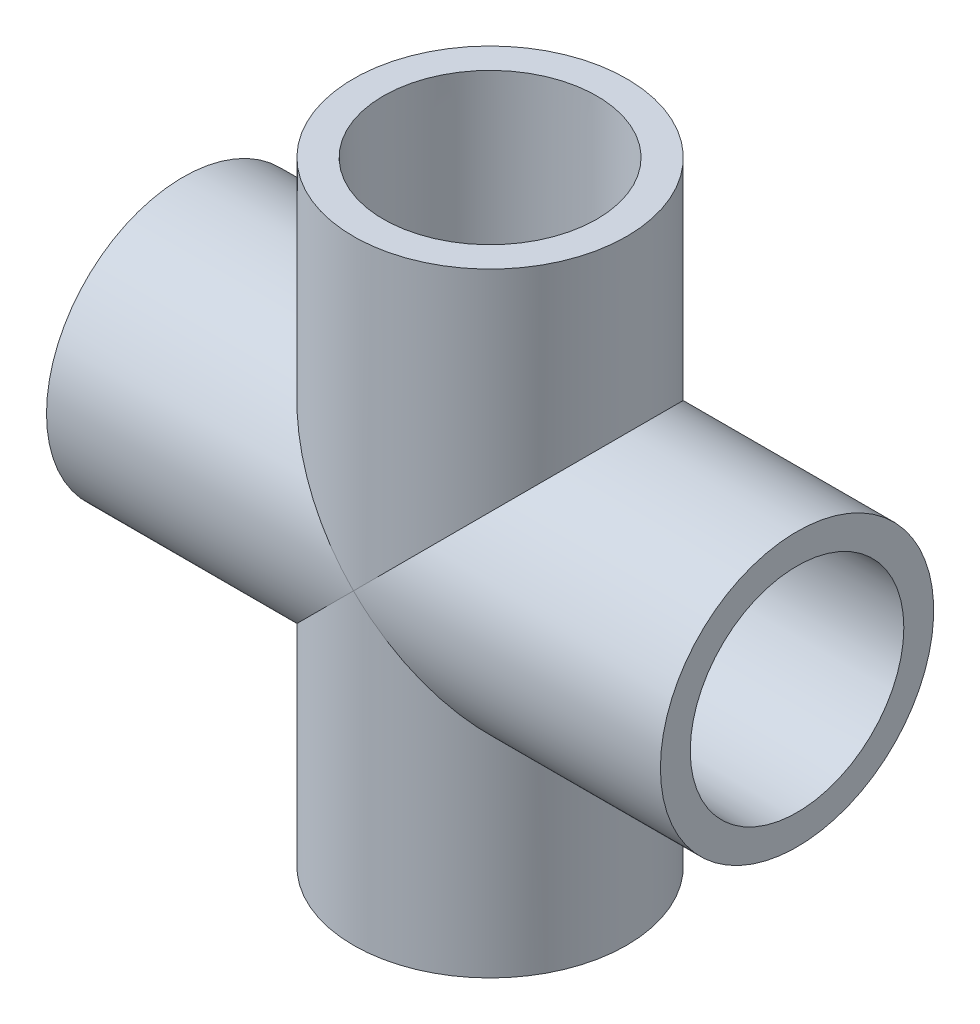
ISO-10303-21;
HEADER;
FILE_DESCRIPTION(('STEP AP214'),'2;1');
FILE_NAME('part.step','',(''),(''),'','','');
FILE_SCHEMA(('AUTOMOTIVE_DESIGN { 1 0 10303 214 1 1 1 1 }'));
ENDSEC;
DATA;
#1=APPLICATION_CONTEXT('core data for automotive mechanical design processes');
#2=APPLICATION_PROTOCOL_DEFINITION('international standard','automotive_design',2000,#1);
#3=PRODUCT_CONTEXT('',#1,'mechanical');
#4=PRODUCT('Part','Part','',(#3));
#5=PRODUCT_RELATED_PRODUCT_CATEGORY('part','',(#4));
#6=PRODUCT_DEFINITION_FORMATION('','',#4);
#7=PRODUCT_DEFINITION_CONTEXT('part definition',#1,'design');
#8=PRODUCT_DEFINITION('design','',#6,#7);
#9=PRODUCT_DEFINITION_SHAPE('','',#8);
#10=(LENGTH_UNIT() NAMED_UNIT(*) SI_UNIT(.MILLI.,.METRE.));
#11=(NAMED_UNIT(*) PLANE_ANGLE_UNIT() SI_UNIT($,.RADIAN.));
#12=(NAMED_UNIT(*) SI_UNIT($,.STERADIAN.) SOLID_ANGLE_UNIT());
#13=UNCERTAINTY_MEASURE_WITH_UNIT(LENGTH_MEASURE(1.E-05),#10,'distance_accuracy_value','');
#14=(GEOMETRIC_REPRESENTATION_CONTEXT(3) GLOBAL_UNCERTAINTY_ASSIGNED_CONTEXT((#13)) GLOBAL_UNIT_ASSIGNED_CONTEXT((#10,
#11,#12)) REPRESENTATION_CONTEXT('',''));
#15=CARTESIAN_POINT('',(0.,0.,0.));
#16=DIRECTION('',(0.,0.,1.));
#17=DIRECTION('',(1.,0.,0.));
#18=AXIS2_PLACEMENT_3D('',#15,#16,#17);
#19=CARTESIAN_POINT('',(0.,13.49375,0.));
#20=DIRECTION('',(0.,-1.,0.));
#21=DIRECTION('',(1.,0.,0.));
#22=AXIS2_PLACEMENT_3D('',#19,#20,#21);
#23=PLANE('',#22);
#24=CARTESIAN_POINT('',(0.,13.49375,0.));
#25=DIRECTION('',(0.,-1.,0.));
#26=DIRECTION('',(1.,0.,0.));
#27=AXIS2_PLACEMENT_3D('',#24,#25,#26);
#28=CIRCLE('',#27,10.6172);
#29=CARTESIAN_POINT('',(10.6172,13.49375,0.));
#30=VERTEX_POINT('',#29);
#31=EDGE_CURVE('E82',#30,#30,#28,.T.);
#32=ORIENTED_EDGE('',*,*,#31,.F.);
#33=EDGE_LOOP('',(#32));
#34=FACE_BOUND('',#33,.T.);
#35=CARTESIAN_POINT('',(0.,13.49375,0.));
#36=DIRECTION('',(0.,1.,0.));
#37=DIRECTION('',(-1.,0.,0.));
#38=AXIS2_PLACEMENT_3D('',#35,#36,#37);
#39=CIRCLE('',#38,7.89940000000001);
#40=CARTESIAN_POINT('',(-7.89940000000001,13.49375,0.));
#41=VERTEX_POINT('',#40);
#42=EDGE_CURVE('E126',#41,#41,#39,.T.);
#43=ORIENTED_EDGE('',*,*,#42,.F.);
#44=EDGE_LOOP('',(#43));
#45=FACE_BOUND('',#44,.T.);
#46=ADVANCED_FACE('F34',(#34,#45),#23,.F.);
#47=CARTESIAN_POINT('',(0.,-13.49375,0.));
#48=DIRECTION('',(0.,-1.,0.));
#49=DIRECTION('',(1.,0.,0.));
#50=AXIS2_PLACEMENT_3D('',#47,#48,#49);
#51=PLANE('',#50);
#52=CARTESIAN_POINT('',(0.,-13.49375,0.));
#53=DIRECTION('',(0.,1.,0.));
#54=DIRECTION('',(-1.,0.,0.));
#55=AXIS2_PLACEMENT_3D('',#52,#53,#54);
#56=CIRCLE('',#55,7.89940000000001);
#57=CARTESIAN_POINT('',(-7.89940000000001,-13.49375,0.));
#58=VERTEX_POINT('',#57);
#59=EDGE_CURVE('E129',#58,#58,#56,.T.);
#60=ORIENTED_EDGE('',*,*,#59,.T.);
#61=EDGE_LOOP('',(#60));
#62=FACE_BOUND('',#61,.T.);
#63=CARTESIAN_POINT('',(0.,-13.49375,0.));
#64=DIRECTION('',(0.,-1.,0.));
#65=DIRECTION('',(1.,0.,0.));
#66=AXIS2_PLACEMENT_3D('',#63,#64,#65);
#67=CIRCLE('',#66,10.6172);
#68=CARTESIAN_POINT('',(10.6172,-13.49375,0.));
#69=VERTEX_POINT('',#68);
#70=EDGE_CURVE('E117',#69,#69,#67,.T.);
#71=ORIENTED_EDGE('',*,*,#70,.T.);
#72=EDGE_LOOP('',(#71));
#73=FACE_BOUND('',#72,.T.);
#74=ADVANCED_FACE('F133',(#62,#73),#51,.T.);
#75=CARTESIAN_POINT('',(30.95625,0.,0.));
#76=DIRECTION('',(1.,0.,0.));
#77=DIRECTION('',(0.,0.,-1.));
#78=AXIS2_PLACEMENT_3D('',#75,#76,#77);
#79=CYLINDRICAL_SURFACE('',#78,7.8994);
#80=CARTESIAN_POINT('',(13.49375,0.,0.));
#81=DIRECTION('',(1.,0.,0.));
#82=DIRECTION('',(0.,0.,-1.));
#83=AXIS2_PLACEMENT_3D('',#80,#81,#82);
#84=CIRCLE('',#83,7.8994);
#85=CARTESIAN_POINT('',(13.49375,0.,-7.8994));
#86=VERTEX_POINT('',#85);
#87=EDGE_CURVE('E123',#86,#86,#84,.T.);
#88=ORIENTED_EDGE('',*,*,#87,.T.);
#89=EDGE_LOOP('',(#88));
#90=FACE_BOUND('',#89,.T.);
#91=CARTESIAN_POINT('',(0.,0.,0.));
#92=DIRECTION('',(0.707106781186548,-0.707106781186547,0.));
#93=DIRECTION('',(0.707106781186547,0.707106781186548,0.));
#94=AXIS2_PLACEMENT_3D('',#91,#92,#93);
#95=ELLIPSE('',#94,11.17143861461,7.8994);
#96=CARTESIAN_POINT('',(0.,0.,7.8994));
#97=VERTEX_POINT('',#96);
#98=CARTESIAN_POINT('',(0.,0.,-7.8994));
#99=VERTEX_POINT('',#98);
#100=EDGE_CURVE('E47',#97,#99,#95,.F.);
#101=ORIENTED_EDGE('',*,*,#100,.T.);
#102=CARTESIAN_POINT('',(0.,0.,0.));
#103=DIRECTION('',(0.707106781186547,0.707106781186548,0.));
#104=DIRECTION('',(0.707106781186548,-0.707106781186547,0.));
#105=AXIS2_PLACEMENT_3D('',#102,#103,#104);
#106=ELLIPSE('',#105,11.17143861461,7.8994);
#107=EDGE_CURVE('E11',#99,#97,#106,.F.);
#108=ORIENTED_EDGE('',*,*,#107,.T.);
#109=EDGE_LOOP('',(#101,#108));
#110=FACE_BOUND('',#109,.T.);
#111=ADVANCED_FACE('F74',(#90,#110),#79,.F.);
#112=CARTESIAN_POINT('',(-13.49375,0.,0.));
#113=DIRECTION('',(1.,0.,0.));
#114=DIRECTION('',(0.,0.,-1.));
#115=AXIS2_PLACEMENT_3D('',#112,#113,#114);
#116=CIRCLE('',#115,7.8994);
#117=CARTESIAN_POINT('',(-13.49375,0.,-7.8994));
#118=VERTEX_POINT('',#117);
#119=EDGE_CURVE('E120',#118,#118,#116,.T.);
#120=ORIENTED_EDGE('',*,*,#119,.F.);
#121=EDGE_LOOP('',(#120));
#122=FACE_BOUND('',#121,.T.);
#123=CARTESIAN_POINT('',(0.,0.,0.));
#124=DIRECTION('',(0.707106781186548,-0.707106781186547,0.));
#125=DIRECTION('',(0.707106781186547,0.707106781186548,0.));
#126=AXIS2_PLACEMENT_3D('',#123,#124,#125);
#127=ELLIPSE('',#126,11.17143861461,7.8994);
#128=EDGE_CURVE('E64',#97,#99,#127,.T.);
#129=ORIENTED_EDGE('',*,*,#128,.T.);
#130=CARTESIAN_POINT('',(0.,0.,0.));
#131=DIRECTION('',(0.707106781186547,0.707106781186548,0.));
#132=DIRECTION('',(0.707106781186548,-0.707106781186547,0.));
#133=AXIS2_PLACEMENT_3D('',#130,#131,#132);
#134=ELLIPSE('',#133,11.17143861461,7.8994);
#135=EDGE_CURVE('E42',#99,#97,#134,.T.);
#136=ORIENTED_EDGE('',*,*,#135,.T.);
#137=EDGE_LOOP('',(#129,#136));
#138=FACE_BOUND('',#137,.T.);
#139=ADVANCED_FACE('F75',(#122,#138),#79,.F.);
#140=CARTESIAN_POINT('',(-13.49375,0.,0.));
#141=DIRECTION('',(1.,0.,0.));
#142=DIRECTION('',(0.,0.,-1.));
#143=AXIS2_PLACEMENT_3D('',#140,#141,#142);
#144=PLANE('',#143);
#145=ORIENTED_EDGE('',*,*,#119,.T.);
#146=EDGE_LOOP('',(#145));
#147=FACE_BOUND('',#146,.T.);
#148=CARTESIAN_POINT('',(-13.49375,0.,0.));
#149=DIRECTION('',(-1.,0.,0.));
#150=DIRECTION('',(0.,0.,1.));
#151=AXIS2_PLACEMENT_3D('',#148,#149,#150);
#152=CIRCLE('',#151,10.6172);
#153=CARTESIAN_POINT('',(-13.49375,0.,10.6172));
#154=VERTEX_POINT('',#153);
#155=EDGE_CURVE('E94',#154,#154,#152,.T.);
#156=ORIENTED_EDGE('',*,*,#155,.T.);
#157=EDGE_LOOP('',(#156));
#158=FACE_BOUND('',#157,.T.);
#159=ADVANCED_FACE('F181',(#147,#158),#144,.F.);
#160=CARTESIAN_POINT('',(13.49375,0.,0.));
#161=DIRECTION('',(1.,0.,0.));
#162=DIRECTION('',(0.,0.,-1.));
#163=AXIS2_PLACEMENT_3D('',#160,#161,#162);
#164=PLANE('',#163);
#165=CARTESIAN_POINT('',(13.49375,0.,0.));
#166=DIRECTION('',(1.,0.,0.));
#167=DIRECTION('',(0.,0.,-1.));
#168=AXIS2_PLACEMENT_3D('',#165,#166,#167);
#169=CIRCLE('',#168,10.6172);
#170=CARTESIAN_POINT('',(13.49375,0.,-10.6172));
#171=VERTEX_POINT('',#170);
#172=EDGE_CURVE('E72',#171,#171,#169,.F.);
#173=ORIENTED_EDGE('',*,*,#172,.F.);
#174=EDGE_LOOP('',(#173));
#175=FACE_BOUND('',#174,.T.);
#176=ORIENTED_EDGE('',*,*,#87,.F.);
#177=EDGE_LOOP('',(#176));
#178=FACE_BOUND('',#177,.T.);
#179=ADVANCED_FACE('F177',(#175,#178),#164,.T.);
#180=CARTESIAN_POINT('',(13.49375,0.,0.));
#181=DIRECTION('',(-1.,0.,0.));
#182=DIRECTION('',(0.,0.,1.));
#183=AXIS2_PLACEMENT_3D('',#180,#181,#182);
#184=CYLINDRICAL_SURFACE('',#183,13.7795);
#185=CARTESIAN_POINT('',(30.95625,0.,0.));
#186=DIRECTION('',(-1.,0.,0.));
#187=DIRECTION('',(0.,0.,1.));
#188=AXIS2_PLACEMENT_3D('',#185,#186,#187);
#189=CIRCLE('',#188,13.7795);
#190=CARTESIAN_POINT('',(30.95625,0.,13.7795));
#191=VERTEX_POINT('',#190);
#192=EDGE_CURVE('E105',#191,#191,#189,.T.);
#193=ORIENTED_EDGE('',*,*,#192,.T.);
#194=EDGE_LOOP('',(#193));
#195=FACE_BOUND('',#194,.T.);
#196=CARTESIAN_POINT('',(0.,0.,0.));
#197=DIRECTION('',(-0.707106781186547,-0.707106781186547,0.));
#198=DIRECTION('',(-0.707106781186547,0.707106781186547,0.));
#199=AXIS2_PLACEMENT_3D('',#196,#197,#198);
#200=ELLIPSE('',#199,19.4871557827201,13.7795);
#201=CARTESIAN_POINT('',(0.,0.,-13.7795));
#202=VERTEX_POINT('',#201);
#203=CARTESIAN_POINT('',(0.,0.,13.7795));
#204=VERTEX_POINT('',#203);
#205=EDGE_CURVE('E109',#202,#204,#200,.T.);
#206=ORIENTED_EDGE('',*,*,#205,.F.);
#207=CARTESIAN_POINT('',(0.,0.,0.));
#208=DIRECTION('',(0.707106781186547,-0.707106781186548,0.));
#209=DIRECTION('',(-0.707106781186548,-0.707106781186547,0.));
#210=AXIS2_PLACEMENT_3D('',#207,#208,#209);
#211=ELLIPSE('',#210,19.4871557827201,13.7795);
#212=EDGE_CURVE('E100',#202,#204,#211,.T.);
#213=ORIENTED_EDGE('',*,*,#212,.T.);
#214=EDGE_LOOP('',(#206,#213));
#215=FACE_BOUND('',#214,.T.);
#216=ADVANCED_FACE('F180',(#195,#215),#184,.T.);
#217=CARTESIAN_POINT('',(-30.95625,0.,0.));
#218=DIRECTION('',(-1.,0.,0.));
#219=DIRECTION('',(0.,0.,1.));
#220=AXIS2_PLACEMENT_3D('',#217,#218,#219);
#221=CIRCLE('',#220,13.7795);
#222=CARTESIAN_POINT('',(-30.95625,0.,13.7795));
#223=VERTEX_POINT('',#222);
#224=EDGE_CURVE('E97',#223,#223,#221,.T.);
#225=ORIENTED_EDGE('',*,*,#224,.F.);
#226=EDGE_LOOP('',(#225));
#227=FACE_BOUND('',#226,.T.);
#228=CARTESIAN_POINT('',(0.,0.,0.));
#229=DIRECTION('',(-0.707106781186548,-0.707106781186547,0.));
#230=DIRECTION('',(0.707106781186547,-0.707106781186548,0.));
#231=AXIS2_PLACEMENT_3D('',#228,#229,#230);
#232=ELLIPSE('',#231,19.4871557827201,13.7795);
#233=EDGE_CURVE('E88',#204,#202,#232,.T.);
#234=ORIENTED_EDGE('',*,*,#233,.T.);
#235=CARTESIAN_POINT('',(0.,0.,0.));
#236=DIRECTION('',(-0.707106781186547,0.707106781186547,0.));
#237=DIRECTION('',(-0.707106781186547,-0.707106781186547,0.));
#238=AXIS2_PLACEMENT_3D('',#235,#236,#237);
#239=ELLIPSE('',#238,19.4871557827201,13.7795);
#240=EDGE_CURVE('E54',#204,#202,#239,.F.);
#241=ORIENTED_EDGE('',*,*,#240,.F.);
#242=EDGE_LOOP('',(#234,#241));
#243=FACE_BOUND('',#242,.T.);
#244=ADVANCED_FACE('F171',(#227,#243),#184,.T.);
#245=CARTESIAN_POINT('',(-13.49375,0.,0.));
#246=DIRECTION('',(-1.,0.,0.));
#247=DIRECTION('',(0.,0.,1.));
#248=AXIS2_PLACEMENT_3D('',#245,#246,#247);
#249=CONICAL_SURFACE('',#248,10.6172,0.00872705116564709);
#250=CARTESIAN_POINT('',(-30.95625,0.,0.));
#251=DIRECTION('',(-1.,0.,0.));
#252=DIRECTION('',(0.,0.,1.));
#253=AXIS2_PLACEMENT_3D('',#250,#251,#252);
#254=CIRCLE('',#253,10.7696);
#255=CARTESIAN_POINT('',(-30.95625,0.,10.7696));
#256=VERTEX_POINT('',#255);
#257=EDGE_CURVE('E91',#256,#256,#254,.T.);
#258=ORIENTED_EDGE('',*,*,#257,.T.);
#259=EDGE_LOOP('',(#258));
#260=FACE_BOUND('',#259,.T.);
#261=ORIENTED_EDGE('',*,*,#155,.F.);
#262=EDGE_LOOP('',(#261));
#263=FACE_BOUND('',#262,.T.);
#264=ADVANCED_FACE('F163',(#260,#263),#249,.F.);
#265=CARTESIAN_POINT('',(30.95625,0.,0.));
#266=DIRECTION('',(1.,0.,0.));
#267=DIRECTION('',(0.,0.,-1.));
#268=AXIS2_PLACEMENT_3D('',#265,#266,#267);
#269=CONICAL_SURFACE('',#268,10.7696,0.00872705116564689);
#270=CARTESIAN_POINT('',(30.95625,0.,0.));
#271=DIRECTION('',(-1.,0.,0.));
#272=DIRECTION('',(0.,0.,1.));
#273=AXIS2_PLACEMENT_3D('',#270,#271,#272);
#274=CIRCLE('',#273,10.7696);
#275=CARTESIAN_POINT('',(30.95625,0.,10.7696));
#276=VERTEX_POINT('',#275);
#277=EDGE_CURVE('E102',#276,#276,#274,.T.);
#278=ORIENTED_EDGE('',*,*,#277,.F.);
#279=EDGE_LOOP('',(#278));
#280=FACE_BOUND('',#279,.T.);
#281=ORIENTED_EDGE('',*,*,#172,.T.);
#282=EDGE_LOOP('',(#281));
#283=FACE_BOUND('',#282,.T.);
#284=ADVANCED_FACE('F159',(#280,#283),#269,.F.);
#285=CARTESIAN_POINT('',(0.,30.95625,0.));
#286=DIRECTION('',(0.,1.,0.));
#287=DIRECTION('',(-1.,0.,0.));
#288=AXIS2_PLACEMENT_3D('',#285,#286,#287);
#289=CONICAL_SURFACE('',#288,10.7696,0.00872705116564708);
#290=CARTESIAN_POINT('',(0.,30.95625,0.));
#291=DIRECTION('',(0.,-1.,0.));
#292=DIRECTION('',(1.,0.,0.));
#293=AXIS2_PLACEMENT_3D('',#290,#291,#292);
#294=CIRCLE('',#293,10.7696);
#295=CARTESIAN_POINT('',(10.7696,30.95625,0.));
#296=VERTEX_POINT('',#295);
#297=EDGE_CURVE('E85',#296,#296,#294,.T.);
#298=ORIENTED_EDGE('',*,*,#297,.F.);
#299=EDGE_LOOP('',(#298));
#300=FACE_BOUND('',#299,.T.);
#301=ORIENTED_EDGE('',*,*,#31,.T.);
#302=EDGE_LOOP('',(#301));
#303=FACE_BOUND('',#302,.T.);
#304=ADVANCED_FACE('F162',(#300,#303),#289,.F.);
#305=CARTESIAN_POINT('',(13.7795,30.95625,0.));
#306=DIRECTION('',(0.,1.,0.));
#307=DIRECTION('',(-1.,0.,0.));
#308=AXIS2_PLACEMENT_3D('',#305,#306,#307);
#309=PLANE('',#308);
#310=ORIENTED_EDGE('',*,*,#297,.T.);
#311=EDGE_LOOP('',(#310));
#312=FACE_BOUND('',#311,.T.);
#313=CARTESIAN_POINT('',(0.,30.95625,0.));
#314=DIRECTION('',(0.,-1.,0.));
#315=DIRECTION('',(1.,0.,0.));
#316=AXIS2_PLACEMENT_3D('',#313,#314,#315);
#317=CIRCLE('',#316,13.7795);
#318=CARTESIAN_POINT('',(13.7795,30.95625,0.));
#319=VERTEX_POINT('',#318);
#320=EDGE_CURVE('E79',#319,#319,#317,.T.);
#321=ORIENTED_EDGE('',*,*,#320,.F.);
#322=EDGE_LOOP('',(#321));
#323=FACE_BOUND('',#322,.T.);
#324=ADVANCED_FACE('F36',(#312,#323),#309,.T.);
#325=CARTESIAN_POINT('',(0.,0.,0.));
#326=DIRECTION('',(0.,-1.,0.));
#327=DIRECTION('',(1.,0.,0.));
#328=AXIS2_PLACEMENT_3D('',#325,#326,#327);
#329=CYLINDRICAL_SURFACE('',#328,13.7795);
#330=ORIENTED_EDGE('',*,*,#212,.F.);
#331=ORIENTED_EDGE('',*,*,#233,.F.);
#332=EDGE_LOOP('',(#330,#331));
#333=FACE_BOUND('',#332,.T.);
#334=ORIENTED_EDGE('',*,*,#320,.T.);
#335=EDGE_LOOP('',(#334));
#336=FACE_BOUND('',#335,.T.);
#337=ADVANCED_FACE('F175',(#333,#336),#329,.T.);
#338=CARTESIAN_POINT('',(-30.95625,-13.7795,0.));
#339=DIRECTION('',(-1.,0.,0.));
#340=DIRECTION('',(0.,0.,1.));
#341=AXIS2_PLACEMENT_3D('',#338,#339,#340);
#342=PLANE('',#341);
#343=ORIENTED_EDGE('',*,*,#224,.T.);
#344=EDGE_LOOP('',(#343));
#345=FACE_BOUND('',#344,.T.);
#346=ORIENTED_EDGE('',*,*,#257,.F.);
#347=EDGE_LOOP('',(#346));
#348=FACE_BOUND('',#347,.T.);
#349=ADVANCED_FACE('F167',(#345,#348),#342,.T.);
#350=CARTESIAN_POINT('',(30.95625,-13.7795,0.));
#351=DIRECTION('',(1.,0.,0.));
#352=DIRECTION('',(0.,0.,-1.));
#353=AXIS2_PLACEMENT_3D('',#350,#351,#352);
#354=PLANE('',#353);
#355=ORIENTED_EDGE('',*,*,#277,.T.);
#356=EDGE_LOOP('',(#355));
#357=FACE_BOUND('',#356,.T.);
#358=ORIENTED_EDGE('',*,*,#192,.F.);
#359=EDGE_LOOP('',(#358));
#360=FACE_BOUND('',#359,.T.);
#361=ADVANCED_FACE('F158',(#357,#360),#354,.T.);
#362=CARTESIAN_POINT('',(0.,-13.49375,0.));
#363=DIRECTION('',(0.,1.,0.));
#364=DIRECTION('',(-1.,0.,0.));
#365=AXIS2_PLACEMENT_3D('',#362,#363,#364);
#366=CYLINDRICAL_SURFACE('',#365,13.7795);
#367=ORIENTED_EDGE('',*,*,#205,.T.);
#368=ORIENTED_EDGE('',*,*,#240,.T.);
#369=EDGE_LOOP('',(#367,#368));
#370=FACE_BOUND('',#369,.T.);
#371=CARTESIAN_POINT('',(0.,-30.95625,0.));
#372=DIRECTION('',(0.,-1.,0.));
#373=DIRECTION('',(1.,0.,0.));
#374=AXIS2_PLACEMENT_3D('',#371,#372,#373);
#375=CIRCLE('',#374,13.7795);
#376=CARTESIAN_POINT('',(13.7795,-30.95625,0.));
#377=VERTEX_POINT('',#376);
#378=EDGE_CURVE('E111',#377,#377,#375,.T.);
#379=ORIENTED_EDGE('',*,*,#378,.F.);
#380=EDGE_LOOP('',(#379));
#381=FACE_BOUND('',#380,.T.);
#382=ADVANCED_FACE('F154',(#370,#381),#366,.T.);
#383=CARTESIAN_POINT('',(0.,-13.49375,0.));
#384=DIRECTION('',(0.,-1.,0.));
#385=DIRECTION('',(1.,0.,0.));
#386=AXIS2_PLACEMENT_3D('',#383,#384,#385);
#387=CONICAL_SURFACE('',#386,10.6172,0.00872705116564748);
#388=CARTESIAN_POINT('',(0.,-30.95625,0.));
#389=DIRECTION('',(0.,-1.,0.));
#390=DIRECTION('',(1.,0.,0.));
#391=AXIS2_PLACEMENT_3D('',#388,#389,#390);
#392=CIRCLE('',#391,10.7696);
#393=CARTESIAN_POINT('',(10.7696,-30.95625,0.));
#394=VERTEX_POINT('',#393);
#395=EDGE_CURVE('E114',#394,#394,#392,.T.);
#396=ORIENTED_EDGE('',*,*,#395,.T.);
#397=EDGE_LOOP('',(#396));
#398=FACE_BOUND('',#397,.T.);
#399=ORIENTED_EDGE('',*,*,#70,.F.);
#400=EDGE_LOOP('',(#399));
#401=FACE_BOUND('',#400,.T.);
#402=ADVANCED_FACE('F157',(#398,#401),#387,.F.);
#403=CARTESIAN_POINT('',(13.7795,-30.95625,0.));
#404=DIRECTION('',(0.,-1.,0.));
#405=DIRECTION('',(1.,0.,0.));
#406=AXIS2_PLACEMENT_3D('',#403,#404,#405);
#407=PLANE('',#406);
#408=ORIENTED_EDGE('',*,*,#378,.T.);
#409=EDGE_LOOP('',(#408));
#410=FACE_BOUND('',#409,.T.);
#411=ORIENTED_EDGE('',*,*,#395,.F.);
#412=EDGE_LOOP('',(#411));
#413=FACE_BOUND('',#412,.T.);
#414=ADVANCED_FACE('F140',(#410,#413),#407,.T.);
#415=CARTESIAN_POINT('',(0.,30.95625,0.));
#416=DIRECTION('',(0.,1.,0.));
#417=DIRECTION('',(-1.,0.,0.));
#418=AXIS2_PLACEMENT_3D('',#415,#416,#417);
#419=CYLINDRICAL_SURFACE('',#418,7.89940000000001);
#420=ORIENTED_EDGE('',*,*,#42,.T.);
#421=EDGE_LOOP('',(#420));
#422=FACE_BOUND('',#421,.T.);
#423=ORIENTED_EDGE('',*,*,#100,.F.);
#424=ORIENTED_EDGE('',*,*,#135,.F.);
#425=EDGE_LOOP('',(#423,#424));
#426=FACE_BOUND('',#425,.T.);
#427=ADVANCED_FACE('F71',(#422,#426),#419,.F.);
#428=ORIENTED_EDGE('',*,*,#128,.F.);
#429=ORIENTED_EDGE('',*,*,#107,.F.);
#430=EDGE_LOOP('',(#428,#429));
#431=FACE_BOUND('',#430,.T.);
#432=ORIENTED_EDGE('',*,*,#59,.F.);
#433=EDGE_LOOP('',(#432));
#434=FACE_BOUND('',#433,.T.);
#435=ADVANCED_FACE('F65',(#431,#434),#419,.F.);
#436=CLOSED_SHELL('',(#46,#74,#111,#139,#159,#179,#216,#244,#264,#284,#304,#324,#337,#349,#361,
#382,#402,#414,#427,#435));
#437=MANIFOLD_SOLID_BREP('B2',#436);
#438=ADVANCED_BREP_SHAPE_REPRESENTATION('',(#18,#437),#14);
#439=SHAPE_DEFINITION_REPRESENTATION(#9,#438);
ENDSEC;
END-ISO-10303-21;
